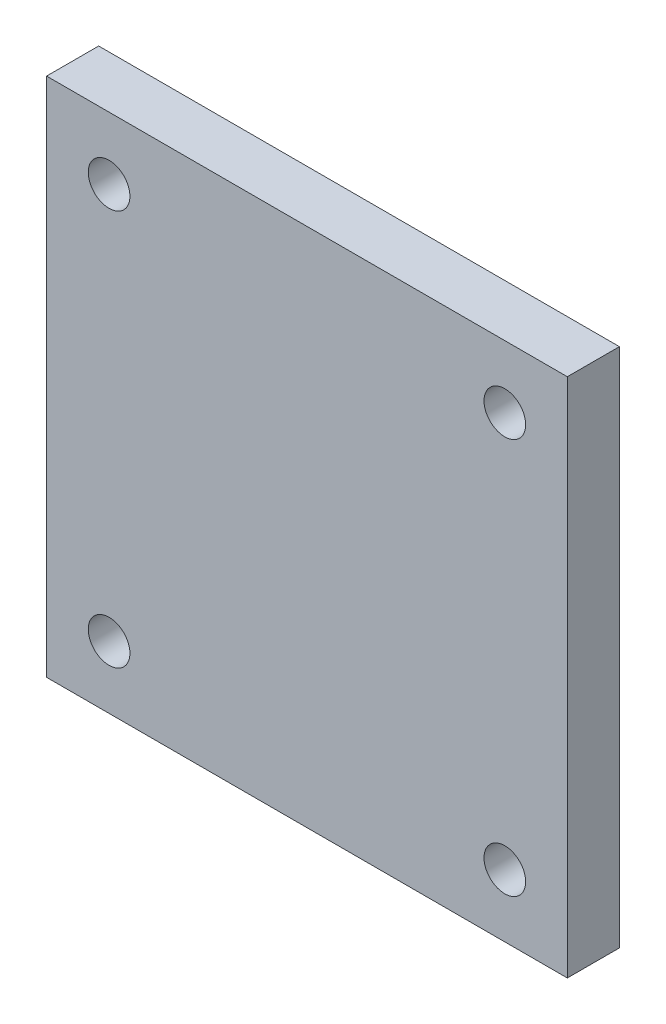
ISO-10303-21;
HEADER;
FILE_DESCRIPTION(('STEP AP214'),'2;1');
FILE_NAME('part.step','',(''),(''),'','','');
FILE_SCHEMA(('AUTOMOTIVE_DESIGN { 1 0 10303 214 1 1 1 1 }'));
ENDSEC;
DATA;
#1=APPLICATION_CONTEXT('core data for automotive mechanical design processes');
#2=APPLICATION_PROTOCOL_DEFINITION('international standard','automotive_design',2000,#1);
#3=PRODUCT_CONTEXT('',#1,'mechanical');
#4=PRODUCT('Part','Part','',(#3));
#5=PRODUCT_RELATED_PRODUCT_CATEGORY('part','',(#4));
#6=PRODUCT_DEFINITION_FORMATION('','',#4);
#7=PRODUCT_DEFINITION_CONTEXT('part definition',#1,'design');
#8=PRODUCT_DEFINITION('design','',#6,#7);
#9=PRODUCT_DEFINITION_SHAPE('','',#8);
#10=(LENGTH_UNIT() NAMED_UNIT(*) SI_UNIT(.MILLI.,.METRE.));
#11=(NAMED_UNIT(*) PLANE_ANGLE_UNIT() SI_UNIT($,.RADIAN.));
#12=(NAMED_UNIT(*) SI_UNIT($,.STERADIAN.) SOLID_ANGLE_UNIT());
#13=UNCERTAINTY_MEASURE_WITH_UNIT(LENGTH_MEASURE(1.E-05),#10,'distance_accuracy_value','');
#14=(GEOMETRIC_REPRESENTATION_CONTEXT(3) GLOBAL_UNCERTAINTY_ASSIGNED_CONTEXT((#13)) GLOBAL_UNIT_ASSIGNED_CONTEXT((#10,
#11,#12)) REPRESENTATION_CONTEXT('',''));
#15=CARTESIAN_POINT('',(0.,0.,0.));
#16=DIRECTION('',(0.,0.,1.));
#17=DIRECTION('',(1.,0.,0.));
#18=AXIS2_PLACEMENT_3D('',#15,#16,#17);
#19=CARTESIAN_POINT('',(25.,25.,5.));
#20=DIRECTION('',(-1.,0.,0.));
#21=DIRECTION('',(0.,-1.,0.));
#22=AXIS2_PLACEMENT_3D('',#19,#20,#21);
#23=PLANE('',#22);
#24=DIRECTION('',(0.,1.,0.));
#25=VECTOR('',#24,1.);
#26=CARTESIAN_POINT('',(25.,25.,0.));
#27=LINE('',#26,#25);
#28=CARTESIAN_POINT('',(25.,-25.,0.));
#29=VERTEX_POINT('',#28);
#30=CARTESIAN_POINT('',(25.,25.,0.));
#31=VERTEX_POINT('',#30);
#32=EDGE_CURVE('E96',#29,#31,#27,.T.);
#33=ORIENTED_EDGE('',*,*,#32,.T.);
#34=DIRECTION('',(0.,0.,-1.));
#35=VECTOR('',#34,1.);
#36=CARTESIAN_POINT('',(25.,25.,5.));
#37=LINE('',#36,#35);
#38=CARTESIAN_POINT('',(25.,25.,5.));
#39=VERTEX_POINT('',#38);
#40=EDGE_CURVE('E11',#39,#31,#37,.T.);
#41=ORIENTED_EDGE('',*,*,#40,.F.);
#42=DIRECTION('',(0.,1.,0.));
#43=VECTOR('',#42,1.);
#44=CARTESIAN_POINT('',(25.,25.,5.));
#45=LINE('',#44,#43);
#46=CARTESIAN_POINT('',(25.,-25.,5.));
#47=VERTEX_POINT('',#46);
#48=EDGE_CURVE('E84',#47,#39,#45,.T.);
#49=ORIENTED_EDGE('',*,*,#48,.F.);
#50=DIRECTION('',(0.,0.,-1.));
#51=VECTOR('',#50,1.);
#52=CARTESIAN_POINT('',(25.,-25.,5.));
#53=LINE('',#52,#51);
#54=EDGE_CURVE('E92',#47,#29,#53,.T.);
#55=ORIENTED_EDGE('',*,*,#54,.T.);
#56=EDGE_LOOP('',(#33,#41,#49,#55));
#57=FACE_BOUND('',#56,.T.);
#58=ADVANCED_FACE('F33',(#57),#23,.F.);
#59=CARTESIAN_POINT('',(-25.,25.,5.));
#60=DIRECTION('',(0.,-1.,0.));
#61=DIRECTION('',(0.,0.,-1.));
#62=AXIS2_PLACEMENT_3D('',#59,#60,#61);
#63=PLANE('',#62);
#64=DIRECTION('',(-1.,0.,0.));
#65=VECTOR('',#64,1.);
#66=CARTESIAN_POINT('',(-25.,25.,0.));
#67=LINE('',#66,#65);
#68=CARTESIAN_POINT('',(-25.,25.,0.));
#69=VERTEX_POINT('',#68);
#70=EDGE_CURVE('E88',#31,#69,#67,.T.);
#71=ORIENTED_EDGE('',*,*,#70,.T.);
#72=DIRECTION('',(0.,0.,-1.));
#73=VECTOR('',#72,1.);
#74=CARTESIAN_POINT('',(-25.,25.,5.));
#75=LINE('',#74,#73);
#76=CARTESIAN_POINT('',(-25.,25.,5.));
#77=VERTEX_POINT('',#76);
#78=EDGE_CURVE('E41',#77,#69,#75,.T.);
#79=ORIENTED_EDGE('',*,*,#78,.F.);
#80=DIRECTION('',(-1.,0.,0.));
#81=VECTOR('',#80,1.);
#82=CARTESIAN_POINT('',(-25.,25.,5.));
#83=LINE('',#82,#81);
#84=EDGE_CURVE('E79',#39,#77,#83,.T.);
#85=ORIENTED_EDGE('',*,*,#84,.F.);
#86=ORIENTED_EDGE('',*,*,#40,.T.);
#87=EDGE_LOOP('',(#71,#79,#85,#86));
#88=FACE_BOUND('',#87,.T.);
#89=ADVANCED_FACE('F87',(#88),#63,.F.);
#90=CARTESIAN_POINT('',(-25.,25.,5.));
#91=DIRECTION('',(1.,0.,0.));
#92=DIRECTION('',(0.,1.,0.));
#93=AXIS2_PLACEMENT_3D('',#90,#91,#92);
#94=PLANE('',#93);
#95=DIRECTION('',(0.,-1.,0.));
#96=VECTOR('',#95,1.);
#97=CARTESIAN_POINT('',(-25.,25.,0.));
#98=LINE('',#97,#96);
#99=CARTESIAN_POINT('',(-25.,-25.,0.));
#100=VERTEX_POINT('',#99);
#101=EDGE_CURVE('E66',#69,#100,#98,.T.);
#102=ORIENTED_EDGE('',*,*,#101,.T.);
#103=DIRECTION('',(0.,0.,-1.));
#104=VECTOR('',#103,1.);
#105=CARTESIAN_POINT('',(-25.,-25.,5.));
#106=LINE('',#105,#104);
#107=CARTESIAN_POINT('',(-25.,-25.,5.));
#108=VERTEX_POINT('',#107);
#109=EDGE_CURVE('E89',#108,#100,#106,.T.);
#110=ORIENTED_EDGE('',*,*,#109,.F.);
#111=DIRECTION('',(0.,-1.,0.));
#112=VECTOR('',#111,1.);
#113=CARTESIAN_POINT('',(-25.,25.,5.));
#114=LINE('',#113,#112);
#115=EDGE_CURVE('E82',#77,#108,#114,.T.);
#116=ORIENTED_EDGE('',*,*,#115,.F.);
#117=ORIENTED_EDGE('',*,*,#78,.T.);
#118=EDGE_LOOP('',(#102,#110,#116,#117));
#119=FACE_BOUND('',#118,.T.);
#120=ADVANCED_FACE('F90',(#119),#94,.F.);
#121=CARTESIAN_POINT('',(-25.,-25.,5.));
#122=DIRECTION('',(0.,1.,0.));
#123=DIRECTION('',(0.,0.,1.));
#124=AXIS2_PLACEMENT_3D('',#121,#122,#123);
#125=PLANE('',#124);
#126=DIRECTION('',(1.,0.,0.));
#127=VECTOR('',#126,1.);
#128=CARTESIAN_POINT('',(-25.,-25.,0.));
#129=LINE('',#128,#127);
#130=EDGE_CURVE('E72',#100,#29,#129,.T.);
#131=ORIENTED_EDGE('',*,*,#130,.T.);
#132=ORIENTED_EDGE('',*,*,#54,.F.);
#133=DIRECTION('',(1.,0.,0.));
#134=VECTOR('',#133,1.);
#135=CARTESIAN_POINT('',(-25.,-25.,5.));
#136=LINE('',#135,#134);
#137=EDGE_CURVE('E49',#108,#47,#136,.T.);
#138=ORIENTED_EDGE('',*,*,#137,.F.);
#139=ORIENTED_EDGE('',*,*,#109,.T.);
#140=EDGE_LOOP('',(#131,#132,#138,#139));
#141=FACE_BOUND('',#140,.T.);
#142=ADVANCED_FACE('F104',(#141),#125,.F.);
#143=CARTESIAN_POINT('',(0.,0.,5.));
#144=DIRECTION('',(0.,0.,1.));
#145=DIRECTION('',(1.,0.,0.));
#146=AXIS2_PLACEMENT_3D('',#143,#144,#145);
#147=PLANE('',#146);
#148=CARTESIAN_POINT('',(19.,19.,5.));
#149=DIRECTION('',(0.,0.,1.));
#150=DIRECTION('',(1.,0.,0.));
#151=AXIS2_PLACEMENT_3D('',#148,#149,#150);
#152=CIRCLE('',#151,2.);
#153=CARTESIAN_POINT('',(21.,19.,5.));
#154=VERTEX_POINT('',#153);
#155=EDGE_CURVE('E115',#154,#154,#152,.T.);
#156=ORIENTED_EDGE('',*,*,#155,.F.);
#157=EDGE_LOOP('',(#156));
#158=FACE_BOUND('',#157,.T.);
#159=CARTESIAN_POINT('',(19.,-19.,5.));
#160=DIRECTION('',(0.,0.,1.));
#161=DIRECTION('',(1.,0.,0.));
#162=AXIS2_PLACEMENT_3D('',#159,#160,#161);
#163=CIRCLE('',#162,2.);
#164=CARTESIAN_POINT('',(21.,-19.,5.));
#165=VERTEX_POINT('',#164);
#166=EDGE_CURVE('E118',#165,#165,#163,.T.);
#167=ORIENTED_EDGE('',*,*,#166,.F.);
#168=EDGE_LOOP('',(#167));
#169=FACE_BOUND('',#168,.T.);
#170=CARTESIAN_POINT('',(-19.,-19.,5.));
#171=DIRECTION('',(0.,0.,1.));
#172=DIRECTION('',(1.,0.,0.));
#173=AXIS2_PLACEMENT_3D('',#170,#171,#172);
#174=CIRCLE('',#173,2.);
#175=CARTESIAN_POINT('',(-17.,-19.,5.));
#176=VERTEX_POINT('',#175);
#177=EDGE_CURVE('E121',#176,#176,#174,.T.);
#178=ORIENTED_EDGE('',*,*,#177,.F.);
#179=EDGE_LOOP('',(#178));
#180=FACE_BOUND('',#179,.T.);
#181=CARTESIAN_POINT('',(-19.,19.,5.));
#182=DIRECTION('',(0.,0.,1.));
#183=DIRECTION('',(1.,0.,0.));
#184=AXIS2_PLACEMENT_3D('',#181,#182,#183);
#185=CIRCLE('',#184,2.);
#186=CARTESIAN_POINT('',(-17.,19.,5.));
#187=VERTEX_POINT('',#186);
#188=EDGE_CURVE('E99',#187,#187,#185,.T.);
#189=ORIENTED_EDGE('',*,*,#188,.F.);
#190=EDGE_LOOP('',(#189));
#191=FACE_BOUND('',#190,.T.);
#192=ORIENTED_EDGE('',*,*,#48,.T.);
#193=ORIENTED_EDGE('',*,*,#84,.T.);
#194=ORIENTED_EDGE('',*,*,#115,.T.);
#195=ORIENTED_EDGE('',*,*,#137,.T.);
#196=EDGE_LOOP('',(#192,#193,#194,#195));
#197=FACE_BOUND('',#196,.T.);
#198=ADVANCED_FACE('F80',(#158,#169,#180,#191,#197),#147,.T.);
#199=CARTESIAN_POINT('',(0.,0.,0.));
#200=DIRECTION('',(0.,0.,1.));
#201=DIRECTION('',(1.,0.,0.));
#202=AXIS2_PLACEMENT_3D('',#199,#200,#201);
#203=PLANE('',#202);
#204=CARTESIAN_POINT('',(19.,19.,0.));
#205=DIRECTION('',(0.,0.,-1.));
#206=DIRECTION('',(-1.,0.,0.));
#207=AXIS2_PLACEMENT_3D('',#204,#205,#206);
#208=CIRCLE('',#207,2.);
#209=CARTESIAN_POINT('',(17.,19.,0.));
#210=VERTEX_POINT('',#209);
#211=EDGE_CURVE('E124',#210,#210,#208,.T.);
#212=ORIENTED_EDGE('',*,*,#211,.F.);
#213=EDGE_LOOP('',(#212));
#214=FACE_BOUND('',#213,.T.);
#215=CARTESIAN_POINT('',(19.,-19.,0.));
#216=DIRECTION('',(0.,0.,-1.));
#217=DIRECTION('',(-1.,0.,0.));
#218=AXIS2_PLACEMENT_3D('',#215,#216,#217);
#219=CIRCLE('',#218,2.);
#220=CARTESIAN_POINT('',(17.,-19.,0.));
#221=VERTEX_POINT('',#220);
#222=EDGE_CURVE('E128',#221,#221,#219,.T.);
#223=ORIENTED_EDGE('',*,*,#222,.F.);
#224=EDGE_LOOP('',(#223));
#225=FACE_BOUND('',#224,.T.);
#226=CARTESIAN_POINT('',(-19.,-19.,0.));
#227=DIRECTION('',(0.,0.,-1.));
#228=DIRECTION('',(-1.,0.,0.));
#229=AXIS2_PLACEMENT_3D('',#226,#227,#228);
#230=CIRCLE('',#229,2.);
#231=CARTESIAN_POINT('',(-21.,-19.,0.));
#232=VERTEX_POINT('',#231);
#233=EDGE_CURVE('E125',#232,#232,#230,.T.);
#234=ORIENTED_EDGE('',*,*,#233,.F.);
#235=EDGE_LOOP('',(#234));
#236=FACE_BOUND('',#235,.T.);
#237=CARTESIAN_POINT('',(-19.,19.,0.));
#238=DIRECTION('',(0.,0.,-1.));
#239=DIRECTION('',(-1.,0.,0.));
#240=AXIS2_PLACEMENT_3D('',#237,#238,#239);
#241=CIRCLE('',#240,2.);
#242=CARTESIAN_POINT('',(-21.,19.,0.));
#243=VERTEX_POINT('',#242);
#244=EDGE_CURVE('E112',#243,#243,#241,.T.);
#245=ORIENTED_EDGE('',*,*,#244,.F.);
#246=EDGE_LOOP('',(#245));
#247=FACE_BOUND('',#246,.T.);
#248=ORIENTED_EDGE('',*,*,#32,.F.);
#249=ORIENTED_EDGE('',*,*,#130,.F.);
#250=ORIENTED_EDGE('',*,*,#101,.F.);
#251=ORIENTED_EDGE('',*,*,#70,.F.);
#252=EDGE_LOOP('',(#248,#249,#250,#251));
#253=FACE_BOUND('',#252,.T.);
#254=ADVANCED_FACE('F107',(#214,#225,#236,#247,#253),#203,.F.);
#255=CARTESIAN_POINT('',(-19.,19.,10.));
#256=DIRECTION('',(0.,0.,-1.));
#257=DIRECTION('',(-1.,0.,0.));
#258=AXIS2_PLACEMENT_3D('',#255,#256,#257);
#259=CYLINDRICAL_SURFACE('',#258,2.);
#260=ORIENTED_EDGE('',*,*,#188,.T.);
#261=EDGE_LOOP('',(#260));
#262=FACE_BOUND('',#261,.T.);
#263=ORIENTED_EDGE('',*,*,#244,.T.);
#264=EDGE_LOOP('',(#263));
#265=FACE_BOUND('',#264,.T.);
#266=ADVANCED_FACE('F138',(#262,#265),#259,.F.);
#267=CARTESIAN_POINT('',(-19.,-19.,10.));
#268=DIRECTION('',(0.,0.,-1.));
#269=DIRECTION('',(-1.,0.,0.));
#270=AXIS2_PLACEMENT_3D('',#267,#268,#269);
#271=CYLINDRICAL_SURFACE('',#270,2.);
#272=ORIENTED_EDGE('',*,*,#177,.T.);
#273=EDGE_LOOP('',(#272));
#274=FACE_BOUND('',#273,.T.);
#275=ORIENTED_EDGE('',*,*,#233,.T.);
#276=EDGE_LOOP('',(#275));
#277=FACE_BOUND('',#276,.T.);
#278=ADVANCED_FACE('F147',(#274,#277),#271,.F.);
#279=CARTESIAN_POINT('',(19.,-19.,10.));
#280=DIRECTION('',(0.,0.,-1.));
#281=DIRECTION('',(-1.,0.,0.));
#282=AXIS2_PLACEMENT_3D('',#279,#280,#281);
#283=CYLINDRICAL_SURFACE('',#282,2.);
#284=ORIENTED_EDGE('',*,*,#166,.T.);
#285=EDGE_LOOP('',(#284));
#286=FACE_BOUND('',#285,.T.);
#287=ORIENTED_EDGE('',*,*,#222,.T.);
#288=EDGE_LOOP('',(#287));
#289=FACE_BOUND('',#288,.T.);
#290=ADVANCED_FACE('F154',(#286,#289),#283,.F.);
#291=CARTESIAN_POINT('',(19.,19.,10.));
#292=DIRECTION('',(0.,0.,-1.));
#293=DIRECTION('',(-1.,0.,0.));
#294=AXIS2_PLACEMENT_3D('',#291,#292,#293);
#295=CYLINDRICAL_SURFACE('',#294,2.);
#296=ORIENTED_EDGE('',*,*,#155,.T.);
#297=EDGE_LOOP('',(#296));
#298=FACE_BOUND('',#297,.T.);
#299=ORIENTED_EDGE('',*,*,#211,.T.);
#300=EDGE_LOOP('',(#299));
#301=FACE_BOUND('',#300,.T.);
#302=ADVANCED_FACE('F134',(#298,#301),#295,.F.);
#303=CLOSED_SHELL('',(#58,#89,#120,#142,#198,#254,#266,#278,#290,#302));
#304=MANIFOLD_SOLID_BREP('B2',#303);
#305=ADVANCED_BREP_SHAPE_REPRESENTATION('',(#18,#304),#14);
#306=SHAPE_DEFINITION_REPRESENTATION(#9,#305);
ENDSEC;
END-ISO-10303-21;
